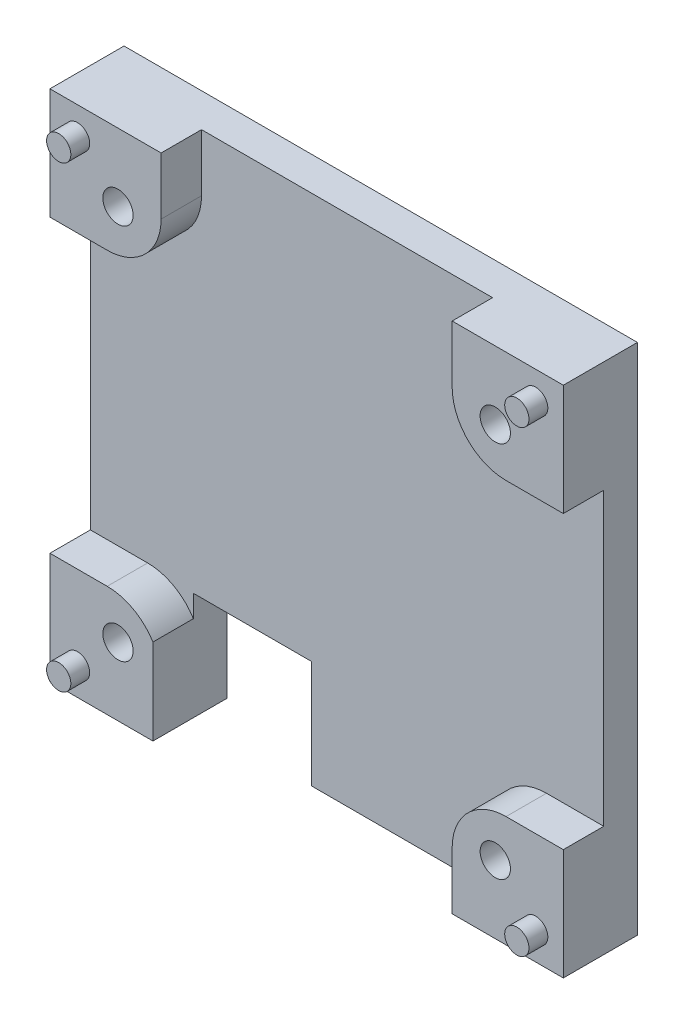
ISO-10303-21;
HEADER;
FILE_DESCRIPTION(('STEP AP214'),'2;1');
FILE_NAME('part.step','',(''),(''),'','','');
FILE_SCHEMA(('AUTOMOTIVE_DESIGN { 1 0 10303 214 1 1 1 1 }'));
ENDSEC;
DATA;
#1=APPLICATION_CONTEXT('core data for automotive mechanical design processes');
#2=APPLICATION_PROTOCOL_DEFINITION('international standard','automotive_design',2000,#1);
#3=PRODUCT_CONTEXT('',#1,'mechanical');
#4=PRODUCT('Part','Part','',(#3));
#5=PRODUCT_RELATED_PRODUCT_CATEGORY('part','',(#4));
#6=PRODUCT_DEFINITION_FORMATION('','',#4);
#7=PRODUCT_DEFINITION_CONTEXT('part definition',#1,'design');
#8=PRODUCT_DEFINITION('design','',#6,#7);
#9=PRODUCT_DEFINITION_SHAPE('','',#8);
#10=(LENGTH_UNIT() NAMED_UNIT(*) SI_UNIT(.MILLI.,.METRE.));
#11=(NAMED_UNIT(*) PLANE_ANGLE_UNIT() SI_UNIT($,.RADIAN.));
#12=(NAMED_UNIT(*) SI_UNIT($,.STERADIAN.) SOLID_ANGLE_UNIT());
#13=UNCERTAINTY_MEASURE_WITH_UNIT(LENGTH_MEASURE(1.E-05),#10,'distance_accuracy_value','');
#14=(GEOMETRIC_REPRESENTATION_CONTEXT(3) GLOBAL_UNCERTAINTY_ASSIGNED_CONTEXT((#13)) GLOBAL_UNIT_ASSIGNED_CONTEXT((#10,
#11,#12)) REPRESENTATION_CONTEXT('',''));
#15=CARTESIAN_POINT('',(0.,0.,0.));
#16=DIRECTION('',(0.,0.,1.));
#17=DIRECTION('',(1.,0.,0.));
#18=AXIS2_PLACEMENT_3D('',#15,#16,#17);
#19=CARTESIAN_POINT('',(-18.5836519970211,-7.48549408860726,-2.5));
#20=DIRECTION('',(0.,-1.,0.));
#21=DIRECTION('',(0.,0.,-1.));
#22=AXIS2_PLACEMENT_3D('',#19,#20,#21);
#23=PLANE('',#22);
#24=DIRECTION('',(0.,0.,-1.));
#25=VECTOR('',#24,1.);
#26=CARTESIAN_POINT('',(-10.9386519970211,-7.48549408860726,7.5));
#27=LINE('',#26,#25);
#28=CARTESIAN_POINT('',(-10.9386519970211,-7.48549408860726,3.));
#29=VERTEX_POINT('',#28);
#30=CARTESIAN_POINT('',(-10.9386519970211,-7.48549408860726,-2.5));
#31=VERTEX_POINT('',#30);
#32=EDGE_CURVE('E214',#29,#31,#27,.T.);
#33=ORIENTED_EDGE('',*,*,#32,.F.);
#34=DIRECTION('',(1.,0.,0.));
#35=VECTOR('',#34,1.);
#36=CARTESIAN_POINT('',(-18.5836519970211,-7.48549408860726,3.));
#37=LINE('',#36,#35);
#38=CARTESIAN_POINT('',(-18.5836519970211,-7.48549408860726,3.));
#39=VERTEX_POINT('',#38);
#40=EDGE_CURVE('E476',#39,#29,#37,.T.);
#41=ORIENTED_EDGE('',*,*,#40,.F.);
#42=DIRECTION('',(0.,0.,1.));
#43=VECTOR('',#42,1.);
#44=CARTESIAN_POINT('',(-18.5836519970211,-7.48549408860726,-2.5));
#45=LINE('',#44,#43);
#46=CARTESIAN_POINT('',(-18.5836519970211,-7.48549408860726,-2.5));
#47=VERTEX_POINT('',#46);
#48=EDGE_CURVE('E248',#47,#39,#45,.T.);
#49=ORIENTED_EDGE('',*,*,#48,.F.);
#50=DIRECTION('',(1.,0.,0.));
#51=VECTOR('',#50,1.);
#52=CARTESIAN_POINT('',(-18.5836519970211,-7.48549408860726,-2.5));
#53=LINE('',#52,#51);
#54=EDGE_CURVE('E231',#47,#31,#53,.T.);
#55=ORIENTED_EDGE('',*,*,#54,.T.);
#56=EDGE_LOOP('',(#33,#41,#49,#55));
#57=FACE_BOUND('',#56,.T.);
#58=ADVANCED_FACE('F43',(#57),#23,.T.);
#59=CARTESIAN_POINT('',(0.,0.,0.));
#60=DIRECTION('',(0.,0.,1.));
#61=DIRECTION('',(1.,0.,0.));
#62=AXIS2_PLACEMENT_3D('',#59,#60,#61);
#63=PLANE('',#62);
#64=DIRECTION('',(0.,1.,0.));
#65=VECTOR('',#64,1.);
#66=CARTESIAN_POINT('',(-2.18865199702105,0.,0.));
#67=LINE('',#66,#65);
#68=CARTESIAN_POINT('',(-2.18865199702105,-7.48549408860726,0.));
#69=VERTEX_POINT('',#68);
#70=CARTESIAN_POINT('',(-2.18865199702105,0.514505911392744,0.));
#71=VERTEX_POINT('',#70);
#72=EDGE_CURVE('E467',#69,#71,#67,.T.);
#73=ORIENTED_EDGE('',*,*,#72,.F.);
#74=DIRECTION('',(1.,0.,0.));
#75=VECTOR('',#74,1.);
#76=CARTESIAN_POINT('',(-18.5836519970211,-7.48549408860726,0.));
#77=LINE('',#76,#75);
#78=CARTESIAN_POINT('',(11.2663480029789,-7.48549408860726,0.));
#79=VERTEX_POINT('',#78);
#80=EDGE_CURVE('E221',#69,#79,#77,.T.);
#81=ORIENTED_EDGE('',*,*,#80,.T.);
#82=DIRECTION('',(0.,-1.,0.));
#83=VECTOR('',#82,1.);
#84=CARTESIAN_POINT('',(11.2663480029789,-7.48549408860726,0.));
#85=LINE('',#84,#83);
#86=CARTESIAN_POINT('',(11.2663480029789,-3.23549408860726,0.));
#87=VERTEX_POINT('',#86);
#88=EDGE_CURVE('E501',#87,#79,#85,.T.);
#89=ORIENTED_EDGE('',*,*,#88,.F.);
#90=CARTESIAN_POINT('',(15.2663480029789,-3.23549408860726,0.));
#91=DIRECTION('',(0.,0.,1.));
#92=DIRECTION('',(1.,0.,0.));
#93=AXIS2_PLACEMENT_3D('',#90,#91,#92);
#94=CIRCLE('',#93,4.);
#95=CARTESIAN_POINT('',(15.2663480029789,0.764505911392739,0.));
#96=VERTEX_POINT('',#95);
#97=EDGE_CURVE('E505',#96,#87,#94,.T.);
#98=ORIENTED_EDGE('',*,*,#97,.F.);
#99=DIRECTION('',(-1.,0.,0.));
#100=VECTOR('',#99,1.);
#101=CARTESIAN_POINT('',(19.516348002979,0.764505911392739,0.));
#102=LINE('',#101,#100);
#103=CARTESIAN_POINT('',(19.5163480029789,0.764505911392738,0.));
#104=VERTEX_POINT('',#103);
#105=EDGE_CURVE('E510',#104,#96,#102,.T.);
#106=ORIENTED_EDGE('',*,*,#105,.F.);
#107=DIRECTION('',(0.,1.,0.));
#108=VECTOR('',#107,1.);
#109=CARTESIAN_POINT('',(19.5163480029789,30.6145059113927,0.));
#110=LINE('',#109,#108);
#111=CARTESIAN_POINT('',(19.5163480029789,22.3645059113927,0.));
#112=VERTEX_POINT('',#111);
#113=EDGE_CURVE('E255',#104,#112,#110,.T.);
#114=ORIENTED_EDGE('',*,*,#113,.T.);
#115=DIRECTION('',(1.,0.,0.));
#116=VECTOR('',#115,1.);
#117=CARTESIAN_POINT('',(19.5163480029789,22.3645059113927,0.));
#118=LINE('',#117,#116);
#119=CARTESIAN_POINT('',(15.2663480029789,22.3645059113927,0.));
#120=VERTEX_POINT('',#119);
#121=EDGE_CURVE('E548',#120,#112,#118,.T.);
#122=ORIENTED_EDGE('',*,*,#121,.F.);
#123=CARTESIAN_POINT('',(15.2663480029789,26.3645059113927,0.));
#124=DIRECTION('',(0.,0.,1.));
#125=DIRECTION('',(-1.,0.,0.));
#126=AXIS2_PLACEMENT_3D('',#123,#124,#125);
#127=CIRCLE('',#126,4.);
#128=CARTESIAN_POINT('',(11.2663480029789,26.3645059113927,0.));
#129=VERTEX_POINT('',#128);
#130=EDGE_CURVE('E302',#129,#120,#127,.T.);
#131=ORIENTED_EDGE('',*,*,#130,.F.);
#132=DIRECTION('',(0.,-1.,0.));
#133=VECTOR('',#132,1.);
#134=CARTESIAN_POINT('',(11.2663480029789,30.6145059113927,0.));
#135=LINE('',#134,#133);
#136=CARTESIAN_POINT('',(11.2663480029789,30.6145059113927,0.));
#137=VERTEX_POINT('',#136);
#138=EDGE_CURVE('E295',#137,#129,#135,.T.);
#139=ORIENTED_EDGE('',*,*,#138,.F.);
#140=DIRECTION('',(-1.,0.,0.));
#141=VECTOR('',#140,1.);
#142=CARTESIAN_POINT('',(-18.5836519970211,30.6145059113927,0.));
#143=LINE('',#142,#141);
#144=CARTESIAN_POINT('',(-10.3336519970211,30.6145059113927,0.));
#145=VERTEX_POINT('',#144);
#146=EDGE_CURVE('E238',#137,#145,#143,.T.);
#147=ORIENTED_EDGE('',*,*,#146,.T.);
#148=DIRECTION('',(0.,1.,0.));
#149=VECTOR('',#148,1.);
#150=CARTESIAN_POINT('',(-10.3336519970211,30.6145059113927,0.));
#151=LINE('',#150,#149);
#152=CARTESIAN_POINT('',(-10.3336519970211,26.3645059113927,0.));
#153=VERTEX_POINT('',#152);
#154=EDGE_CURVE('E312',#153,#145,#151,.T.);
#155=ORIENTED_EDGE('',*,*,#154,.F.);
#156=CARTESIAN_POINT('',(-14.3336519970211,26.3645059113927,0.));
#157=DIRECTION('',(0.,0.,1.));
#158=DIRECTION('',(1.,0.,0.));
#159=AXIS2_PLACEMENT_3D('',#156,#157,#158);
#160=CIRCLE('',#159,4.);
#161=CARTESIAN_POINT('',(-14.3336519970211,22.3645059113927,0.));
#162=VERTEX_POINT('',#161);
#163=EDGE_CURVE('E329',#162,#153,#160,.T.);
#164=ORIENTED_EDGE('',*,*,#163,.F.);
#165=DIRECTION('',(1.,0.,0.));
#166=VECTOR('',#165,1.);
#167=CARTESIAN_POINT('',(-18.5836519970211,22.3645059113927,0.));
#168=LINE('',#167,#166);
#169=CARTESIAN_POINT('',(-18.5836519970211,22.3645059113927,0.));
#170=VERTEX_POINT('',#169);
#171=EDGE_CURVE('E300',#170,#162,#168,.T.);
#172=ORIENTED_EDGE('',*,*,#171,.F.);
#173=DIRECTION('',(0.,-1.,0.));
#174=VECTOR('',#173,1.);
#175=CARTESIAN_POINT('',(-18.5836519970211,30.6145059113927,0.));
#176=LINE('',#175,#174);
#177=CARTESIAN_POINT('',(-18.5836519970211,0.764505911392734,0.));
#178=VERTEX_POINT('',#177);
#179=EDGE_CURVE('E249',#170,#178,#176,.T.);
#180=ORIENTED_EDGE('',*,*,#179,.T.);
#181=DIRECTION('',(-1.,0.,0.));
#182=VECTOR('',#181,1.);
#183=CARTESIAN_POINT('',(-18.5836519970211,0.764505911392735,0.));
#184=LINE('',#183,#182);
#185=CARTESIAN_POINT('',(-14.3336519970211,0.764505911392735,0.));
#186=VERTEX_POINT('',#185);
#187=EDGE_CURVE('E447',#186,#178,#184,.T.);
#188=ORIENTED_EDGE('',*,*,#187,.F.);
#189=CARTESIAN_POINT('',(-14.3336519970211,-3.23549408860727,0.));
#190=DIRECTION('',(0.,0.,1.));
#191=DIRECTION('',(-1.,0.,0.));
#192=AXIS2_PLACEMENT_3D('',#189,#190,#191);
#193=CIRCLE('',#192,4.);
#194=CARTESIAN_POINT('',(-10.9386519970211,-1.12031679107403,0.));
#195=VERTEX_POINT('',#194);
#196=EDGE_CURVE('E66',#195,#186,#193,.T.);
#197=ORIENTED_EDGE('',*,*,#196,.F.);
#198=DIRECTION('',(0.,-1.,0.));
#199=VECTOR('',#198,1.);
#200=CARTESIAN_POINT('',(-10.9386519970211,0.,0.));
#201=LINE('',#200,#199);
#202=CARTESIAN_POINT('',(-10.9386519970211,0.514505911392744,0.));
#203=VERTEX_POINT('',#202);
#204=EDGE_CURVE('E59',#203,#195,#201,.T.);
#205=ORIENTED_EDGE('',*,*,#204,.F.);
#206=DIRECTION('',(-1.,0.,0.));
#207=VECTOR('',#206,1.);
#208=CARTESIAN_POINT('',(0.,0.514505911392744,0.));
#209=LINE('',#208,#207);
#210=EDGE_CURVE('E991',#71,#203,#209,.T.);
#211=ORIENTED_EDGE('',*,*,#210,.F.);
#212=EDGE_LOOP('',(#73,#81,#89,#98,#106,#114,#122,#131,#139,#147,#155,#164,#172,#180,#188,#197,
#205,#211));
#213=FACE_BOUND('',#212,.T.);
#214=ADVANCED_FACE('F394',(#213),#63,.T.);
#215=CARTESIAN_POINT('',(-18.5836519970211,30.6145059113927,-2.5));
#216=DIRECTION('',(-1.,0.,0.));
#217=DIRECTION('',(0.,0.,1.));
#218=AXIS2_PLACEMENT_3D('',#215,#216,#217);
#219=PLANE('',#218);
#220=ORIENTED_EDGE('',*,*,#179,.F.);
#221=DIRECTION('',(0.,0.,-1.));
#222=VECTOR('',#221,1.);
#223=CARTESIAN_POINT('',(-18.5836519970211,22.3645059113927,3.));
#224=LINE('',#223,#222);
#225=CARTESIAN_POINT('',(-18.5836519970211,22.3645059113927,3.));
#226=VERTEX_POINT('',#225);
#227=EDGE_CURVE('E347',#226,#170,#224,.T.);
#228=ORIENTED_EDGE('',*,*,#227,.F.);
#229=DIRECTION('',(0.,-1.,0.));
#230=VECTOR('',#229,1.);
#231=CARTESIAN_POINT('',(-18.5836519970211,30.6145059113927,3.));
#232=LINE('',#231,#230);
#233=CARTESIAN_POINT('',(-18.5836519970211,30.6145059113927,3.));
#234=VERTEX_POINT('',#233);
#235=EDGE_CURVE('E307',#234,#226,#232,.T.);
#236=ORIENTED_EDGE('',*,*,#235,.F.);
#237=DIRECTION('',(0.,0.,1.));
#238=VECTOR('',#237,1.);
#239=CARTESIAN_POINT('',(-18.5836519970211,30.6145059113927,-2.5));
#240=LINE('',#239,#238);
#241=CARTESIAN_POINT('',(-18.5836519970211,30.6145059113927,-2.5));
#242=VERTEX_POINT('',#241);
#243=EDGE_CURVE('E260',#242,#234,#240,.T.);
#244=ORIENTED_EDGE('',*,*,#243,.F.);
#245=DIRECTION('',(0.,-1.,0.));
#246=VECTOR('',#245,1.);
#247=CARTESIAN_POINT('',(-18.5836519970211,30.6145059113927,-2.5));
#248=LINE('',#247,#246);
#249=EDGE_CURVE('E232',#242,#47,#248,.T.);
#250=ORIENTED_EDGE('',*,*,#249,.T.);
#251=ORIENTED_EDGE('',*,*,#48,.T.);
#252=DIRECTION('',(0.,-1.,0.));
#253=VECTOR('',#252,1.);
#254=CARTESIAN_POINT('',(-18.5836519970211,-7.48549408860726,3.));
#255=LINE('',#254,#253);
#256=CARTESIAN_POINT('',(-18.5836519970211,0.764505911392735,3.));
#257=VERTEX_POINT('',#256);
#258=EDGE_CURVE('E457',#257,#39,#255,.T.);
#259=ORIENTED_EDGE('',*,*,#258,.F.);
#260=DIRECTION('',(0.,0.,-1.));
#261=VECTOR('',#260,1.);
#262=CARTESIAN_POINT('',(-18.5836519970211,0.764505911392735,3.));
#263=LINE('',#262,#261);
#264=EDGE_CURVE('E453',#257,#178,#263,.T.);
#265=ORIENTED_EDGE('',*,*,#264,.T.);
#266=EDGE_LOOP('',(#220,#228,#236,#244,#250,#251,#259,#265));
#267=FACE_BOUND('',#266,.T.);
#268=ADVANCED_FACE('F45',(#267),#219,.T.);
#269=CARTESIAN_POINT('',(-18.5836519970211,30.6145059113927,-2.5));
#270=DIRECTION('',(0.,1.,0.));
#271=DIRECTION('',(0.,0.,1.));
#272=AXIS2_PLACEMENT_3D('',#269,#270,#271);
#273=PLANE('',#272);
#274=ORIENTED_EDGE('',*,*,#146,.F.);
#275=DIRECTION('',(0.,0.,-1.));
#276=VECTOR('',#275,1.);
#277=CARTESIAN_POINT('',(11.2663480029789,30.6145059113927,3.));
#278=LINE('',#277,#276);
#279=CARTESIAN_POINT('',(11.2663480029789,30.6145059113927,3.));
#280=VERTEX_POINT('',#279);
#281=EDGE_CURVE('E533',#280,#137,#278,.T.);
#282=ORIENTED_EDGE('',*,*,#281,.F.);
#283=DIRECTION('',(-1.,0.,0.));
#284=VECTOR('',#283,1.);
#285=CARTESIAN_POINT('',(19.5163480029789,30.6145059113927,3.));
#286=LINE('',#285,#284);
#287=CARTESIAN_POINT('',(19.5163480029789,30.6145059113927,3.));
#288=VERTEX_POINT('',#287);
#289=EDGE_CURVE('E562',#288,#280,#286,.T.);
#290=ORIENTED_EDGE('',*,*,#289,.F.);
#291=DIRECTION('',(0.,0.,1.));
#292=VECTOR('',#291,1.);
#293=CARTESIAN_POINT('',(19.5163480029789,30.6145059113927,-2.5));
#294=LINE('',#293,#292);
#295=CARTESIAN_POINT('',(19.5163480029789,30.6145059113927,-2.5));
#296=VERTEX_POINT('',#295);
#297=EDGE_CURVE('E264',#296,#288,#294,.T.);
#298=ORIENTED_EDGE('',*,*,#297,.F.);
#299=DIRECTION('',(-1.,0.,0.));
#300=VECTOR('',#299,1.);
#301=CARTESIAN_POINT('',(-18.5836519970211,30.6145059113927,-2.5));
#302=LINE('',#301,#300);
#303=EDGE_CURVE('E244',#296,#242,#302,.T.);
#304=ORIENTED_EDGE('',*,*,#303,.T.);
#305=ORIENTED_EDGE('',*,*,#243,.T.);
#306=DIRECTION('',(-1.,0.,0.));
#307=VECTOR('',#306,1.);
#308=CARTESIAN_POINT('',(-18.5836519970211,30.6145059113927,3.));
#309=LINE('',#308,#307);
#310=CARTESIAN_POINT('',(-10.3336519970211,30.6145059113927,3.));
#311=VERTEX_POINT('',#310);
#312=EDGE_CURVE('E321',#311,#234,#309,.T.);
#313=ORIENTED_EDGE('',*,*,#312,.F.);
#314=DIRECTION('',(0.,0.,-1.));
#315=VECTOR('',#314,1.);
#316=CARTESIAN_POINT('',(-10.3336519970211,30.6145059113927,3.));
#317=LINE('',#316,#315);
#318=EDGE_CURVE('E325',#311,#145,#317,.T.);
#319=ORIENTED_EDGE('',*,*,#318,.T.);
#320=EDGE_LOOP('',(#274,#282,#290,#298,#304,#305,#313,#319));
#321=FACE_BOUND('',#320,.T.);
#322=ADVANCED_FACE('F411',(#321),#273,.T.);
#323=CARTESIAN_POINT('',(19.5163480029789,30.6145059113927,-2.5));
#324=DIRECTION('',(1.,0.,0.));
#325=DIRECTION('',(0.,0.,-1.));
#326=AXIS2_PLACEMENT_3D('',#323,#324,#325);
#327=PLANE('',#326);
#328=ORIENTED_EDGE('',*,*,#113,.F.);
#329=DIRECTION('',(0.,0.,-1.));
#330=VECTOR('',#329,1.);
#331=CARTESIAN_POINT('',(19.516348002979,0.764505911392739,3.));
#332=LINE('',#331,#330);
#333=CARTESIAN_POINT('',(19.516348002979,0.764505911392739,3.));
#334=VERTEX_POINT('',#333);
#335=EDGE_CURVE('E485',#334,#104,#332,.T.);
#336=ORIENTED_EDGE('',*,*,#335,.F.);
#337=DIRECTION('',(0.,1.,0.));
#338=VECTOR('',#337,1.);
#339=CARTESIAN_POINT('',(19.5163480029789,-7.48549408860726,3.));
#340=LINE('',#339,#338);
#341=CARTESIAN_POINT('',(19.5163480029789,-7.48549408860726,3.));
#342=VERTEX_POINT('',#341);
#343=EDGE_CURVE('E506',#342,#334,#340,.T.);
#344=ORIENTED_EDGE('',*,*,#343,.F.);
#345=DIRECTION('',(0.,0.,1.));
#346=VECTOR('',#345,1.);
#347=CARTESIAN_POINT('',(19.5163480029789,-7.48549408860726,-2.5));
#348=LINE('',#347,#346);
#349=CARTESIAN_POINT('',(19.5163480029789,-7.48549408860726,-2.5));
#350=VERTEX_POINT('',#349);
#351=EDGE_CURVE('E267',#350,#342,#348,.T.);
#352=ORIENTED_EDGE('',*,*,#351,.F.);
#353=DIRECTION('',(0.,1.,0.));
#354=VECTOR('',#353,1.);
#355=CARTESIAN_POINT('',(19.5163480029789,30.6145059113927,-2.5));
#356=LINE('',#355,#354);
#357=EDGE_CURVE('E229',#350,#296,#356,.T.);
#358=ORIENTED_EDGE('',*,*,#357,.T.);
#359=ORIENTED_EDGE('',*,*,#297,.T.);
#360=DIRECTION('',(0.,1.,0.));
#361=VECTOR('',#360,1.);
#362=CARTESIAN_POINT('',(19.5163480029789,30.6145059113927,3.));
#363=LINE('',#362,#361);
#364=CARTESIAN_POINT('',(19.5163480029789,22.3645059113927,3.));
#365=VERTEX_POINT('',#364);
#366=EDGE_CURVE('E288',#365,#288,#363,.T.);
#367=ORIENTED_EDGE('',*,*,#366,.F.);
#368=DIRECTION('',(0.,0.,-1.));
#369=VECTOR('',#368,1.);
#370=CARTESIAN_POINT('',(19.5163480029789,22.3645059113927,3.));
#371=LINE('',#370,#369);
#372=EDGE_CURVE('E543',#365,#112,#371,.T.);
#373=ORIENTED_EDGE('',*,*,#372,.T.);
#374=EDGE_LOOP('',(#328,#336,#344,#352,#358,#359,#367,#373));
#375=FACE_BOUND('',#374,.T.);
#376=ADVANCED_FACE('F404',(#375),#327,.T.);
#377=DIRECTION('',(0.,0.,-1.));
#378=VECTOR('',#377,1.);
#379=CARTESIAN_POINT('',(-2.18865199702105,-7.48549408860726,7.5));
#380=LINE('',#379,#378);
#381=CARTESIAN_POINT('',(-2.18865199702105,-7.48549408860726,-2.5));
#382=VERTEX_POINT('',#381);
#383=EDGE_CURVE('E204',#69,#382,#380,.T.);
#384=ORIENTED_EDGE('',*,*,#383,.T.);
#385=EDGE_CURVE('E218',#382,#350,#53,.T.);
#386=ORIENTED_EDGE('',*,*,#385,.T.);
#387=ORIENTED_EDGE('',*,*,#351,.T.);
#388=DIRECTION('',(1.,0.,0.));
#389=VECTOR('',#388,1.);
#390=CARTESIAN_POINT('',(19.5163480029789,-7.48549408860726,3.));
#391=LINE('',#390,#389);
#392=CARTESIAN_POINT('',(11.2663480029789,-7.48549408860726,3.));
#393=VERTEX_POINT('',#392);
#394=EDGE_CURVE('E500',#393,#342,#391,.T.);
#395=ORIENTED_EDGE('',*,*,#394,.F.);
#396=DIRECTION('',(0.,0.,-1.));
#397=VECTOR('',#396,1.);
#398=CARTESIAN_POINT('',(11.2663480029789,-7.48549408860726,3.));
#399=LINE('',#398,#397);
#400=EDGE_CURVE('E497',#393,#79,#399,.T.);
#401=ORIENTED_EDGE('',*,*,#400,.T.);
#402=ORIENTED_EDGE('',*,*,#80,.F.);
#403=EDGE_LOOP('',(#384,#386,#387,#395,#401,#402));
#404=FACE_BOUND('',#403,.T.);
#405=ADVANCED_FACE('F217',(#404),#23,.T.);
#406=CARTESIAN_POINT('',(0.,0.,-2.5));
#407=DIRECTION('',(0.,0.,1.));
#408=DIRECTION('',(1.,0.,0.));
#409=AXIS2_PLACEMENT_3D('',#406,#407,#408);
#410=PLANE('',#409);
#411=CARTESIAN_POINT('',(-13.5336519970211,-2.43549408860726,-2.5));
#412=DIRECTION('',(0.,0.,1.));
#413=DIRECTION('',(1.,0.,0.));
#414=AXIS2_PLACEMENT_3D('',#411,#412,#413);
#415=CIRCLE('',#414,1.125);
#416=CARTESIAN_POINT('',(-12.4086519970211,-2.43549408860726,-2.5));
#417=VERTEX_POINT('',#416);
#418=EDGE_CURVE('E351',#417,#417,#415,.T.);
#419=ORIENTED_EDGE('',*,*,#418,.T.);
#420=EDGE_LOOP('',(#419));
#421=FACE_BOUND('',#420,.T.);
#422=CARTESIAN_POINT('',(14.4663480029789,-2.43549408860726,-2.5));
#423=DIRECTION('',(0.,0.,1.));
#424=DIRECTION('',(1.,0.,0.));
#425=AXIS2_PLACEMENT_3D('',#422,#423,#424);
#426=CIRCLE('',#425,1.125);
#427=CARTESIAN_POINT('',(15.5913480029789,-2.43549408860726,-2.5));
#428=VERTEX_POINT('',#427);
#429=EDGE_CURVE('E355',#428,#428,#426,.T.);
#430=ORIENTED_EDGE('',*,*,#429,.T.);
#431=EDGE_LOOP('',(#430));
#432=FACE_BOUND('',#431,.T.);
#433=CARTESIAN_POINT('',(14.4663480029789,25.5645059113927,-2.5));
#434=DIRECTION('',(0.,0.,1.));
#435=DIRECTION('',(1.,0.,0.));
#436=AXIS2_PLACEMENT_3D('',#433,#434,#435);
#437=CIRCLE('',#436,1.125);
#438=CARTESIAN_POINT('',(15.5913480029789,25.5645059113927,-2.5));
#439=VERTEX_POINT('',#438);
#440=EDGE_CURVE('E359',#439,#439,#437,.T.);
#441=ORIENTED_EDGE('',*,*,#440,.T.);
#442=EDGE_LOOP('',(#441));
#443=FACE_BOUND('',#442,.T.);
#444=CARTESIAN_POINT('',(-13.5336519970211,25.5645059113927,-2.5));
#445=DIRECTION('',(0.,0.,1.));
#446=DIRECTION('',(1.,0.,0.));
#447=AXIS2_PLACEMENT_3D('',#444,#445,#446);
#448=CIRCLE('',#447,1.125);
#449=CARTESIAN_POINT('',(-12.4086519970211,25.5645059113927,-2.5));
#450=VERTEX_POINT('',#449);
#451=EDGE_CURVE('E252',#450,#450,#448,.T.);
#452=ORIENTED_EDGE('',*,*,#451,.T.);
#453=EDGE_LOOP('',(#452));
#454=FACE_BOUND('',#453,.T.);
#455=DIRECTION('',(0.,1.,0.));
#456=VECTOR('',#455,1.);
#457=CARTESIAN_POINT('',(-10.9386519970211,0.514505911392744,-2.5));
#458=LINE('',#457,#456);
#459=CARTESIAN_POINT('',(-10.9386519970211,0.514505911392744,-2.5));
#460=VERTEX_POINT('',#459);
#461=EDGE_CURVE('E213',#31,#460,#458,.T.);
#462=ORIENTED_EDGE('',*,*,#461,.F.);
#463=ORIENTED_EDGE('',*,*,#54,.F.);
#464=ORIENTED_EDGE('',*,*,#249,.F.);
#465=ORIENTED_EDGE('',*,*,#303,.F.);
#466=ORIENTED_EDGE('',*,*,#357,.F.);
#467=ORIENTED_EDGE('',*,*,#385,.F.);
#468=DIRECTION('',(0.,-1.,0.));
#469=VECTOR('',#468,1.);
#470=CARTESIAN_POINT('',(-2.18865199702105,0.514505911392744,-2.5));
#471=LINE('',#470,#469);
#472=CARTESIAN_POINT('',(-2.18865199702105,0.514505911392744,-2.5));
#473=VERTEX_POINT('',#472);
#474=EDGE_CURVE('E201',#473,#382,#471,.T.);
#475=ORIENTED_EDGE('',*,*,#474,.F.);
#476=DIRECTION('',(1.,0.,0.));
#477=VECTOR('',#476,1.);
#478=CARTESIAN_POINT('',(-2.18865199702105,0.514505911392744,-2.5));
#479=LINE('',#478,#477);
#480=EDGE_CURVE('E997',#460,#473,#479,.T.);
#481=ORIENTED_EDGE('',*,*,#480,.F.);
#482=EDGE_LOOP('',(#462,#463,#464,#465,#466,#467,#475,#481));
#483=FACE_BOUND('',#482,.T.);
#484=ADVANCED_FACE('F226',(#421,#432,#443,#454,#483),#410,.F.);
#485=CARTESIAN_POINT('',(-13.5336519970211,25.5645059113927,-2.5));
#486=DIRECTION('',(0.,0.,1.));
#487=DIRECTION('',(1.,0.,0.));
#488=AXIS2_PLACEMENT_3D('',#485,#486,#487);
#489=CYLINDRICAL_SURFACE('',#488,1.125);
#490=ORIENTED_EDGE('',*,*,#451,.F.);
#491=EDGE_LOOP('',(#490));
#492=FACE_BOUND('',#491,.T.);
#493=CARTESIAN_POINT('',(-13.5336519970211,25.5645059113927,3.));
#494=DIRECTION('',(0.,0.,1.));
#495=DIRECTION('',(1.,0.,0.));
#496=AXIS2_PLACEMENT_3D('',#493,#494,#495);
#497=CIRCLE('',#496,1.125);
#498=CARTESIAN_POINT('',(-12.4086519970211,25.5645059113927,3.));
#499=VERTEX_POINT('',#498);
#500=EDGE_CURVE('E294',#499,#499,#497,.T.);
#501=ORIENTED_EDGE('',*,*,#500,.T.);
#502=EDGE_LOOP('',(#501));
#503=FACE_BOUND('',#502,.T.);
#504=ADVANCED_FACE('F367',(#492,#503),#489,.F.);
#505=CARTESIAN_POINT('',(14.4663480029789,25.5645059113927,-2.5));
#506=DIRECTION('',(0.,0.,1.));
#507=DIRECTION('',(1.,0.,0.));
#508=AXIS2_PLACEMENT_3D('',#505,#506,#507);
#509=CYLINDRICAL_SURFACE('',#508,1.125);
#510=ORIENTED_EDGE('',*,*,#440,.F.);
#511=EDGE_LOOP('',(#510));
#512=FACE_BOUND('',#511,.T.);
#513=CARTESIAN_POINT('',(14.4663480029789,25.5645059113927,3.));
#514=DIRECTION('',(0.,0.,1.));
#515=DIRECTION('',(1.,0.,0.));
#516=AXIS2_PLACEMENT_3D('',#513,#514,#515);
#517=CIRCLE('',#516,1.125);
#518=CARTESIAN_POINT('',(15.5913480029789,25.5645059113927,3.));
#519=VERTEX_POINT('',#518);
#520=EDGE_CURVE('E291',#519,#519,#517,.T.);
#521=ORIENTED_EDGE('',*,*,#520,.T.);
#522=EDGE_LOOP('',(#521));
#523=FACE_BOUND('',#522,.T.);
#524=ADVANCED_FACE('F370',(#512,#523),#509,.F.);
#525=CARTESIAN_POINT('',(14.4663480029789,-2.43549408860726,-2.5));
#526=DIRECTION('',(0.,0.,1.));
#527=DIRECTION('',(1.,0.,0.));
#528=AXIS2_PLACEMENT_3D('',#525,#526,#527);
#529=CYLINDRICAL_SURFACE('',#528,1.125);
#530=ORIENTED_EDGE('',*,*,#429,.F.);
#531=EDGE_LOOP('',(#530));
#532=FACE_BOUND('',#531,.T.);
#533=CARTESIAN_POINT('',(14.4663480029789,-2.43549408860726,3.));
#534=DIRECTION('',(0.,0.,1.));
#535=DIRECTION('',(1.,0.,0.));
#536=AXIS2_PLACEMENT_3D('',#533,#534,#535);
#537=CIRCLE('',#536,1.125);
#538=CARTESIAN_POINT('',(15.5913480029789,-2.43549408860726,3.));
#539=VERTEX_POINT('',#538);
#540=EDGE_CURVE('E514',#539,#539,#537,.T.);
#541=ORIENTED_EDGE('',*,*,#540,.T.);
#542=EDGE_LOOP('',(#541));
#543=FACE_BOUND('',#542,.T.);
#544=ADVANCED_FACE('F387',(#532,#543),#529,.F.);
#545=CARTESIAN_POINT('',(-13.5336519970211,-2.43549408860726,-2.5));
#546=DIRECTION('',(0.,0.,1.));
#547=DIRECTION('',(1.,0.,0.));
#548=AXIS2_PLACEMENT_3D('',#545,#546,#547);
#549=CYLINDRICAL_SURFACE('',#548,1.125);
#550=ORIENTED_EDGE('',*,*,#418,.F.);
#551=EDGE_LOOP('',(#550));
#552=FACE_BOUND('',#551,.T.);
#553=CARTESIAN_POINT('',(-13.5336519970211,-2.43549408860726,3.));
#554=DIRECTION('',(0.,0.,1.));
#555=DIRECTION('',(1.,0.,0.));
#556=AXIS2_PLACEMENT_3D('',#553,#554,#555);
#557=CIRCLE('',#556,1.125);
#558=CARTESIAN_POINT('',(-12.4086519970211,-2.43549408860726,3.));
#559=VERTEX_POINT('',#558);
#560=EDGE_CURVE('E472',#559,#559,#557,.T.);
#561=ORIENTED_EDGE('',*,*,#560,.T.);
#562=EDGE_LOOP('',(#561));
#563=FACE_BOUND('',#562,.T.);
#564=ADVANCED_FACE('F377',(#552,#563),#549,.F.);
#565=CARTESIAN_POINT('',(-14.3336519970211,26.3645059113927,3.));
#566=DIRECTION('',(0.,0.,1.));
#567=DIRECTION('',(1.,0.,0.));
#568=AXIS2_PLACEMENT_3D('',#565,#566,#567);
#569=PLANE('',#568);
#570=CARTESIAN_POINT('',(-16.5336519970211,28.5645059113927,3.));
#571=DIRECTION('',(0.,0.,1.));
#572=DIRECTION('',(1.,0.,0.));
#573=AXIS2_PLACEMENT_3D('',#570,#571,#572);
#574=CIRCLE('',#573,0.900000000000001);
#575=CARTESIAN_POINT('',(-15.6336519970211,28.5645059113927,3.));
#576=VERTEX_POINT('',#575);
#577=EDGE_CURVE('E1025',#576,#576,#574,.T.);
#578=ORIENTED_EDGE('',*,*,#577,.F.);
#579=EDGE_LOOP('',(#578));
#580=FACE_BOUND('',#579,.T.);
#581=ORIENTED_EDGE('',*,*,#235,.T.);
#582=DIRECTION('',(1.,0.,0.));
#583=VECTOR('',#582,1.);
#584=CARTESIAN_POINT('',(-18.5836519970211,22.3645059113927,3.));
#585=LINE('',#584,#583);
#586=CARTESIAN_POINT('',(-14.3336519970211,22.3645059113927,3.));
#587=VERTEX_POINT('',#586);
#588=EDGE_CURVE('E311',#226,#587,#585,.T.);
#589=ORIENTED_EDGE('',*,*,#588,.T.);
#590=CARTESIAN_POINT('',(-14.3336519970211,26.3645059113927,3.));
#591=DIRECTION('',(0.,0.,1.));
#592=DIRECTION('',(1.,0.,0.));
#593=AXIS2_PLACEMENT_3D('',#590,#591,#592);
#594=CIRCLE('',#593,4.);
#595=CARTESIAN_POINT('',(-10.3336519970211,26.3645059113927,3.));
#596=VERTEX_POINT('',#595);
#597=EDGE_CURVE('E315',#587,#596,#594,.T.);
#598=ORIENTED_EDGE('',*,*,#597,.T.);
#599=DIRECTION('',(0.,1.,0.));
#600=VECTOR('',#599,1.);
#601=CARTESIAN_POINT('',(-10.3336519970211,30.6145059113927,3.));
#602=LINE('',#601,#600);
#603=EDGE_CURVE('E318',#596,#311,#602,.T.);
#604=ORIENTED_EDGE('',*,*,#603,.T.);
#605=ORIENTED_EDGE('',*,*,#312,.T.);
#606=EDGE_LOOP('',(#581,#589,#598,#604,#605));
#607=FACE_BOUND('',#606,.T.);
#608=ORIENTED_EDGE('',*,*,#500,.F.);
#609=EDGE_LOOP('',(#608));
#610=FACE_BOUND('',#609,.T.);
#611=ADVANCED_FACE('F374',(#580,#607,#610),#569,.T.);
#612=CARTESIAN_POINT('',(-18.5836519970211,22.3645059113927,3.));
#613=DIRECTION('',(0.,1.,0.));
#614=DIRECTION('',(-1.,0.,0.));
#615=AXIS2_PLACEMENT_3D('',#612,#613,#614);
#616=PLANE('',#615);
#617=ORIENTED_EDGE('',*,*,#171,.T.);
#618=DIRECTION('',(0.,0.,-1.));
#619=VECTOR('',#618,1.);
#620=CARTESIAN_POINT('',(-14.3336519970211,22.3645059113927,3.));
#621=LINE('',#620,#619);
#622=EDGE_CURVE('E343',#587,#162,#621,.T.);
#623=ORIENTED_EDGE('',*,*,#622,.F.);
#624=ORIENTED_EDGE('',*,*,#588,.F.);
#625=ORIENTED_EDGE('',*,*,#227,.T.);
#626=EDGE_LOOP('',(#617,#623,#624,#625));
#627=FACE_BOUND('',#626,.T.);
#628=ADVANCED_FACE('F376',(#627),#616,.F.);
#629=CARTESIAN_POINT('',(-14.3336519970211,26.3645059113927,3.));
#630=DIRECTION('',(0.,0.,-1.));
#631=DIRECTION('',(-1.,0.,0.));
#632=AXIS2_PLACEMENT_3D('',#629,#630,#631);
#633=CYLINDRICAL_SURFACE('',#632,4.);
#634=ORIENTED_EDGE('',*,*,#163,.T.);
#635=DIRECTION('',(0.,0.,-1.));
#636=VECTOR('',#635,1.);
#637=CARTESIAN_POINT('',(-10.3336519970211,26.3645059113927,3.));
#638=LINE('',#637,#636);
#639=EDGE_CURVE('E339',#596,#153,#638,.T.);
#640=ORIENTED_EDGE('',*,*,#639,.F.);
#641=ORIENTED_EDGE('',*,*,#597,.F.);
#642=ORIENTED_EDGE('',*,*,#622,.T.);
#643=EDGE_LOOP('',(#634,#640,#641,#642));
#644=FACE_BOUND('',#643,.T.);
#645=ADVANCED_FACE('F384',(#644),#633,.T.);
#646=CARTESIAN_POINT('',(-10.3336519970211,30.6145059113927,3.));
#647=DIRECTION('',(-1.,0.,0.));
#648=DIRECTION('',(0.,0.,1.));
#649=AXIS2_PLACEMENT_3D('',#646,#647,#648);
#650=PLANE('',#649);
#651=ORIENTED_EDGE('',*,*,#154,.T.);
#652=ORIENTED_EDGE('',*,*,#318,.F.);
#653=ORIENTED_EDGE('',*,*,#603,.F.);
#654=ORIENTED_EDGE('',*,*,#639,.T.);
#655=EDGE_LOOP('',(#651,#652,#653,#654));
#656=FACE_BOUND('',#655,.T.);
#657=ADVANCED_FACE('F283',(#656),#650,.F.);
#658=CARTESIAN_POINT('',(15.2663480029789,26.3645059113927,3.));
#659=DIRECTION('',(0.,0.,-1.));
#660=DIRECTION('',(-1.,0.,0.));
#661=AXIS2_PLACEMENT_3D('',#658,#659,#660);
#662=PLANE('',#661);
#663=CARTESIAN_POINT('',(17.466348002979,28.5645059113927,3.));
#664=DIRECTION('',(0.,0.,-1.));
#665=DIRECTION('',(-1.,0.,0.));
#666=AXIS2_PLACEMENT_3D('',#663,#664,#665);
#667=CIRCLE('',#666,0.900000000000001);
#668=CARTESIAN_POINT('',(16.5663480029789,28.5645059113927,3.));
#669=VERTEX_POINT('',#668);
#670=EDGE_CURVE('E52',#669,#669,#667,.F.);
#671=ORIENTED_EDGE('',*,*,#670,.F.);
#672=EDGE_LOOP('',(#671));
#673=FACE_BOUND('',#672,.T.);
#674=ORIENTED_EDGE('',*,*,#366,.T.);
#675=ORIENTED_EDGE('',*,*,#289,.T.);
#676=DIRECTION('',(0.,-1.,0.));
#677=VECTOR('',#676,1.);
#678=CARTESIAN_POINT('',(11.2663480029789,30.6145059113927,3.));
#679=LINE('',#678,#677);
#680=CARTESIAN_POINT('',(11.2663480029789,26.3645059113927,3.));
#681=VERTEX_POINT('',#680);
#682=EDGE_CURVE('E560',#280,#681,#679,.T.);
#683=ORIENTED_EDGE('',*,*,#682,.T.);
#684=CARTESIAN_POINT('',(15.2663480029789,26.3645059113927,3.));
#685=DIRECTION('',(0.,0.,1.));
#686=DIRECTION('',(-1.,0.,0.));
#687=AXIS2_PLACEMENT_3D('',#684,#685,#686);
#688=CIRCLE('',#687,4.);
#689=CARTESIAN_POINT('',(15.2663480029789,22.3645059113927,3.));
#690=VERTEX_POINT('',#689);
#691=EDGE_CURVE('E557',#681,#690,#688,.T.);
#692=ORIENTED_EDGE('',*,*,#691,.T.);
#693=DIRECTION('',(1.,0.,0.));
#694=VECTOR('',#693,1.);
#695=CARTESIAN_POINT('',(19.5163480029789,22.3645059113927,3.));
#696=LINE('',#695,#694);
#697=EDGE_CURVE('E547',#690,#365,#696,.T.);
#698=ORIENTED_EDGE('',*,*,#697,.T.);
#699=EDGE_LOOP('',(#674,#675,#683,#692,#698));
#700=FACE_BOUND('',#699,.T.);
#701=ORIENTED_EDGE('',*,*,#520,.F.);
#702=EDGE_LOOP('',(#701));
#703=FACE_BOUND('',#702,.T.);
#704=ADVANCED_FACE('F279',(#673,#700,#703),#662,.F.);
#705=CARTESIAN_POINT('',(11.2663480029789,30.6145059113927,3.));
#706=DIRECTION('',(1.,0.,0.));
#707=DIRECTION('',(0.,0.,-1.));
#708=AXIS2_PLACEMENT_3D('',#705,#706,#707);
#709=PLANE('',#708);
#710=ORIENTED_EDGE('',*,*,#138,.T.);
#711=DIRECTION('',(0.,0.,-1.));
#712=VECTOR('',#711,1.);
#713=CARTESIAN_POINT('',(11.2663480029789,26.3645059113927,3.));
#714=LINE('',#713,#712);
#715=EDGE_CURVE('E536',#681,#129,#714,.T.);
#716=ORIENTED_EDGE('',*,*,#715,.F.);
#717=ORIENTED_EDGE('',*,*,#682,.F.);
#718=ORIENTED_EDGE('',*,*,#281,.T.);
#719=EDGE_LOOP('',(#710,#716,#717,#718));
#720=FACE_BOUND('',#719,.T.);
#721=ADVANCED_FACE('F282',(#720),#709,.F.);
#722=CARTESIAN_POINT('',(15.2663480029789,26.3645059113927,3.));
#723=DIRECTION('',(0.,0.,-1.));
#724=DIRECTION('',(-1.,0.,0.));
#725=AXIS2_PLACEMENT_3D('',#722,#723,#724);
#726=CYLINDRICAL_SURFACE('',#725,4.);
#727=ORIENTED_EDGE('',*,*,#130,.T.);
#728=DIRECTION('',(0.,0.,-1.));
#729=VECTOR('',#728,1.);
#730=CARTESIAN_POINT('',(15.2663480029789,22.3645059113927,3.));
#731=LINE('',#730,#729);
#732=EDGE_CURVE('E540',#690,#120,#731,.T.);
#733=ORIENTED_EDGE('',*,*,#732,.F.);
#734=ORIENTED_EDGE('',*,*,#691,.F.);
#735=ORIENTED_EDGE('',*,*,#715,.T.);
#736=EDGE_LOOP('',(#727,#733,#734,#735));
#737=FACE_BOUND('',#736,.T.);
#738=ADVANCED_FACE('F574',(#737),#726,.T.);
#739=CARTESIAN_POINT('',(19.5163480029789,22.3645059113927,3.));
#740=DIRECTION('',(0.,1.,0.));
#741=DIRECTION('',(0.,0.,1.));
#742=AXIS2_PLACEMENT_3D('',#739,#740,#741);
#743=PLANE('',#742);
#744=ORIENTED_EDGE('',*,*,#121,.T.);
#745=ORIENTED_EDGE('',*,*,#372,.F.);
#746=ORIENTED_EDGE('',*,*,#697,.F.);
#747=ORIENTED_EDGE('',*,*,#732,.T.);
#748=EDGE_LOOP('',(#744,#745,#746,#747));
#749=FACE_BOUND('',#748,.T.);
#750=ADVANCED_FACE('F578',(#749),#743,.F.);
#751=CARTESIAN_POINT('',(15.2663480029789,-3.23549408860726,3.));
#752=DIRECTION('',(0.,0.,1.));
#753=DIRECTION('',(1.,0.,0.));
#754=AXIS2_PLACEMENT_3D('',#751,#752,#753);
#755=PLANE('',#754);
#756=CARTESIAN_POINT('',(17.466348002979,-5.43549408860726,3.));
#757=DIRECTION('',(0.,0.,1.));
#758=DIRECTION('',(1.,0.,0.));
#759=AXIS2_PLACEMENT_3D('',#756,#757,#758);
#760=CIRCLE('',#759,0.9);
#761=CARTESIAN_POINT('',(18.366348002979,-5.43549408860726,3.));
#762=VERTEX_POINT('',#761);
#763=EDGE_CURVE('E1036',#762,#762,#760,.T.);
#764=ORIENTED_EDGE('',*,*,#763,.F.);
#765=EDGE_LOOP('',(#764));
#766=FACE_BOUND('',#765,.T.);
#767=ORIENTED_EDGE('',*,*,#343,.T.);
#768=DIRECTION('',(-1.,0.,0.));
#769=VECTOR('',#768,1.);
#770=CARTESIAN_POINT('',(19.516348002979,0.764505911392739,3.));
#771=LINE('',#770,#769);
#772=CARTESIAN_POINT('',(15.2663480029789,0.764505911392739,3.));
#773=VERTEX_POINT('',#772);
#774=EDGE_CURVE('E524',#334,#773,#771,.T.);
#775=ORIENTED_EDGE('',*,*,#774,.T.);
#776=CARTESIAN_POINT('',(15.2663480029789,-3.23549408860726,3.));
#777=DIRECTION('',(0.,0.,1.));
#778=DIRECTION('',(1.,0.,0.));
#779=AXIS2_PLACEMENT_3D('',#776,#777,#778);
#780=CIRCLE('',#779,4.);
#781=CARTESIAN_POINT('',(11.2663480029789,-3.23549408860726,3.));
#782=VERTEX_POINT('',#781);
#783=EDGE_CURVE('E521',#773,#782,#780,.T.);
#784=ORIENTED_EDGE('',*,*,#783,.T.);
#785=DIRECTION('',(0.,-1.,0.));
#786=VECTOR('',#785,1.);
#787=CARTESIAN_POINT('',(11.2663480029789,-7.48549408860726,3.));
#788=LINE('',#787,#786);
#789=EDGE_CURVE('E518',#782,#393,#788,.T.);
#790=ORIENTED_EDGE('',*,*,#789,.T.);
#791=ORIENTED_EDGE('',*,*,#394,.T.);
#792=EDGE_LOOP('',(#767,#775,#784,#790,#791));
#793=FACE_BOUND('',#792,.T.);
#794=ORIENTED_EDGE('',*,*,#540,.F.);
#795=EDGE_LOOP('',(#794));
#796=FACE_BOUND('',#795,.T.);
#797=ADVANCED_FACE('F607',(#766,#793,#796),#755,.T.);
#798=CARTESIAN_POINT('',(19.516348002979,0.764505911392739,3.));
#799=DIRECTION('',(0.,-1.,0.));
#800=DIRECTION('',(1.,0.,0.));
#801=AXIS2_PLACEMENT_3D('',#798,#799,#800);
#802=PLANE('',#801);
#803=ORIENTED_EDGE('',*,*,#105,.T.);
#804=DIRECTION('',(0.,0.,-1.));
#805=VECTOR('',#804,1.);
#806=CARTESIAN_POINT('',(15.2663480029789,0.764505911392739,3.));
#807=LINE('',#806,#805);
#808=EDGE_CURVE('E489',#773,#96,#807,.T.);
#809=ORIENTED_EDGE('',*,*,#808,.F.);
#810=ORIENTED_EDGE('',*,*,#774,.F.);
#811=ORIENTED_EDGE('',*,*,#335,.T.);
#812=EDGE_LOOP('',(#803,#809,#810,#811));
#813=FACE_BOUND('',#812,.T.);
#814=ADVANCED_FACE('F603',(#813),#802,.F.);
#815=CARTESIAN_POINT('',(15.2663480029789,-3.23549408860726,3.));
#816=DIRECTION('',(0.,0.,-1.));
#817=DIRECTION('',(-1.,0.,0.));
#818=AXIS2_PLACEMENT_3D('',#815,#816,#817);
#819=CYLINDRICAL_SURFACE('',#818,4.);
#820=ORIENTED_EDGE('',*,*,#97,.T.);
#821=DIRECTION('',(0.,0.,-1.));
#822=VECTOR('',#821,1.);
#823=CARTESIAN_POINT('',(11.2663480029789,-3.23549408860726,3.));
#824=LINE('',#823,#822);
#825=EDGE_CURVE('E493',#782,#87,#824,.T.);
#826=ORIENTED_EDGE('',*,*,#825,.F.);
#827=ORIENTED_EDGE('',*,*,#783,.F.);
#828=ORIENTED_EDGE('',*,*,#808,.T.);
#829=EDGE_LOOP('',(#820,#826,#827,#828));
#830=FACE_BOUND('',#829,.T.);
#831=ADVANCED_FACE('F606',(#830),#819,.T.);
#832=CARTESIAN_POINT('',(11.2663480029789,-7.48549408860726,3.));
#833=DIRECTION('',(1.,0.,0.));
#834=DIRECTION('',(0.,0.,-1.));
#835=AXIS2_PLACEMENT_3D('',#832,#833,#834);
#836=PLANE('',#835);
#837=ORIENTED_EDGE('',*,*,#88,.T.);
#838=ORIENTED_EDGE('',*,*,#400,.F.);
#839=ORIENTED_EDGE('',*,*,#789,.F.);
#840=ORIENTED_EDGE('',*,*,#825,.T.);
#841=EDGE_LOOP('',(#837,#838,#839,#840));
#842=FACE_BOUND('',#841,.T.);
#843=ADVANCED_FACE('F597',(#842),#836,.F.);
#844=CARTESIAN_POINT('',(-14.3336519970211,-3.23549408860727,3.));
#845=DIRECTION('',(0.,0.,-1.));
#846=DIRECTION('',(-1.,0.,0.));
#847=AXIS2_PLACEMENT_3D('',#844,#845,#846);
#848=PLANE('',#847);
#849=CARTESIAN_POINT('',(-16.5336519970211,-5.43549408860726,3.));
#850=DIRECTION('',(0.,0.,-1.));
#851=DIRECTION('',(-1.,0.,0.));
#852=AXIS2_PLACEMENT_3D('',#849,#850,#851);
#853=CIRCLE('',#852,0.9);
#854=CARTESIAN_POINT('',(-17.4336519970211,-5.43549408860726,3.));
#855=VERTEX_POINT('',#854);
#856=EDGE_CURVE('E11',#855,#855,#853,.F.);
#857=ORIENTED_EDGE('',*,*,#856,.F.);
#858=EDGE_LOOP('',(#857));
#859=FACE_BOUND('',#858,.T.);
#860=ORIENTED_EDGE('',*,*,#40,.T.);
#861=DIRECTION('',(0.,1.,0.));
#862=VECTOR('',#861,1.);
#863=CARTESIAN_POINT('',(-10.9386519970211,-3.23549408860727,3.));
#864=LINE('',#863,#862);
#865=CARTESIAN_POINT('',(-10.9386519970211,-1.12031679107403,3.));
#866=VERTEX_POINT('',#865);
#867=EDGE_CURVE('E588',#29,#866,#864,.T.);
#868=ORIENTED_EDGE('',*,*,#867,.T.);
#869=CARTESIAN_POINT('',(-14.3336519970211,-3.23549408860727,3.));
#870=DIRECTION('',(0.,0.,1.));
#871=DIRECTION('',(-1.,0.,0.));
#872=AXIS2_PLACEMENT_3D('',#869,#870,#871);
#873=CIRCLE('',#872,4.);
#874=CARTESIAN_POINT('',(-14.3336519970211,0.764505911392735,3.));
#875=VERTEX_POINT('',#874);
#876=EDGE_CURVE('E465',#866,#875,#873,.T.);
#877=ORIENTED_EDGE('',*,*,#876,.T.);
#878=DIRECTION('',(-1.,0.,0.));
#879=VECTOR('',#878,1.);
#880=CARTESIAN_POINT('',(-18.5836519970211,0.764505911392735,3.));
#881=LINE('',#880,#879);
#882=EDGE_CURVE('E461',#875,#257,#881,.T.);
#883=ORIENTED_EDGE('',*,*,#882,.T.);
#884=ORIENTED_EDGE('',*,*,#258,.T.);
#885=EDGE_LOOP('',(#860,#868,#877,#883,#884));
#886=FACE_BOUND('',#885,.T.);
#887=ORIENTED_EDGE('',*,*,#560,.F.);
#888=EDGE_LOOP('',(#887));
#889=FACE_BOUND('',#888,.T.);
#890=ADVANCED_FACE('F585',(#859,#886,#889),#848,.F.);
#891=CARTESIAN_POINT('',(-14.3336519970211,-3.23549408860727,3.));
#892=DIRECTION('',(0.,0.,-1.));
#893=DIRECTION('',(-1.,0.,0.));
#894=AXIS2_PLACEMENT_3D('',#891,#892,#893);
#895=CYLINDRICAL_SURFACE('',#894,4.);
#896=ORIENTED_EDGE('',*,*,#876,.F.);
#897=DIRECTION('',(0.,0.,-1.));
#898=VECTOR('',#897,1.);
#899=CARTESIAN_POINT('',(-10.9386519970211,-1.12031679107403,3.));
#900=LINE('',#899,#898);
#901=EDGE_CURVE('E263',#866,#195,#900,.T.);
#902=ORIENTED_EDGE('',*,*,#901,.T.);
#903=ORIENTED_EDGE('',*,*,#196,.T.);
#904=DIRECTION('',(0.,0.,-1.));
#905=VECTOR('',#904,1.);
#906=CARTESIAN_POINT('',(-14.3336519970211,0.764505911392735,3.));
#907=LINE('',#906,#905);
#908=EDGE_CURVE('E455',#875,#186,#907,.T.);
#909=ORIENTED_EDGE('',*,*,#908,.F.);
#910=EDGE_LOOP('',(#896,#902,#903,#909));
#911=FACE_BOUND('',#910,.T.);
#912=ADVANCED_FACE('F589',(#911),#895,.T.);
#913=CARTESIAN_POINT('',(-18.5836519970211,0.764505911392735,3.));
#914=DIRECTION('',(0.,-1.,0.));
#915=DIRECTION('',(1.,0.,0.));
#916=AXIS2_PLACEMENT_3D('',#913,#914,#915);
#917=PLANE('',#916);
#918=ORIENTED_EDGE('',*,*,#187,.T.);
#919=ORIENTED_EDGE('',*,*,#264,.F.);
#920=ORIENTED_EDGE('',*,*,#882,.F.);
#921=ORIENTED_EDGE('',*,*,#908,.T.);
#922=EDGE_LOOP('',(#918,#919,#920,#921));
#923=FACE_BOUND('',#922,.T.);
#924=ADVANCED_FACE('F451',(#923),#917,.F.);
#925=CARTESIAN_POINT('',(-2.18865199702105,0.514505911392744,7.5));
#926=DIRECTION('',(1.,0.,0.));
#927=DIRECTION('',(0.,0.,-1.));
#928=AXIS2_PLACEMENT_3D('',#925,#926,#927);
#929=PLANE('',#928);
#930=ORIENTED_EDGE('',*,*,#72,.T.);
#931=DIRECTION('',(0.,0.,-1.));
#932=VECTOR('',#931,1.);
#933=CARTESIAN_POINT('',(-2.18865199702105,0.514505911392744,7.5));
#934=LINE('',#933,#932);
#935=EDGE_CURVE('E207',#71,#473,#934,.T.);
#936=ORIENTED_EDGE('',*,*,#935,.T.);
#937=ORIENTED_EDGE('',*,*,#474,.T.);
#938=ORIENTED_EDGE('',*,*,#383,.F.);
#939=EDGE_LOOP('',(#930,#936,#937,#938));
#940=FACE_BOUND('',#939,.T.);
#941=ADVANCED_FACE('F203',(#940),#929,.F.);
#942=CARTESIAN_POINT('',(-2.18865199702105,0.514505911392744,7.5));
#943=DIRECTION('',(0.,1.,0.));
#944=DIRECTION('',(-1.,0.,0.));
#945=AXIS2_PLACEMENT_3D('',#942,#943,#944);
#946=PLANE('',#945);
#947=ORIENTED_EDGE('',*,*,#210,.T.);
#948=DIRECTION('',(0.,0.,-1.));
#949=VECTOR('',#948,1.);
#950=CARTESIAN_POINT('',(-10.9386519970211,0.514505911392744,7.5));
#951=LINE('',#950,#949);
#952=EDGE_CURVE('E992',#203,#460,#951,.T.);
#953=ORIENTED_EDGE('',*,*,#952,.T.);
#954=ORIENTED_EDGE('',*,*,#480,.T.);
#955=ORIENTED_EDGE('',*,*,#935,.F.);
#956=EDGE_LOOP('',(#947,#953,#954,#955));
#957=FACE_BOUND('',#956,.T.);
#958=ADVANCED_FACE('F767',(#957),#946,.F.);
#959=CARTESIAN_POINT('',(-10.9386519970211,0.514505911392744,7.5));
#960=DIRECTION('',(-1.,0.,0.));
#961=DIRECTION('',(0.,0.,1.));
#962=AXIS2_PLACEMENT_3D('',#959,#960,#961);
#963=PLANE('',#962);
#964=ORIENTED_EDGE('',*,*,#204,.T.);
#965=ORIENTED_EDGE('',*,*,#901,.F.);
#966=ORIENTED_EDGE('',*,*,#867,.F.);
#967=ORIENTED_EDGE('',*,*,#32,.T.);
#968=ORIENTED_EDGE('',*,*,#461,.T.);
#969=ORIENTED_EDGE('',*,*,#952,.F.);
#970=EDGE_LOOP('',(#964,#965,#966,#967,#968,#969));
#971=FACE_BOUND('',#970,.T.);
#972=ADVANCED_FACE('F662',(#971),#963,.F.);
#973=CARTESIAN_POINT('',(-16.5336519970211,28.5645059113927,4.4));
#974=DIRECTION('',(0.,0.,-1.));
#975=DIRECTION('',(-1.,0.,0.));
#976=AXIS2_PLACEMENT_3D('',#973,#974,#975);
#977=CYLINDRICAL_SURFACE('',#976,0.900000000000001);
#978=CARTESIAN_POINT('',(-16.5336519970211,28.5645059113927,4.4));
#979=DIRECTION('',(0.,0.,1.));
#980=DIRECTION('',(1.,0.,0.));
#981=AXIS2_PLACEMENT_3D('',#978,#979,#980);
#982=CIRCLE('',#981,0.900000000000001);
#983=CARTESIAN_POINT('',(-15.6336519970211,28.5645059113927,4.4));
#984=VERTEX_POINT('',#983);
#985=EDGE_CURVE('E223',#984,#984,#982,.T.);
#986=ORIENTED_EDGE('',*,*,#985,.F.);
#987=EDGE_LOOP('',(#986));
#988=FACE_BOUND('',#987,.T.);
#989=ORIENTED_EDGE('',*,*,#577,.T.);
#990=EDGE_LOOP('',(#989));
#991=FACE_BOUND('',#990,.T.);
#992=ADVANCED_FACE('F656',(#988,#991),#977,.T.);
#993=CARTESIAN_POINT('',(-16.5336519970211,28.5645059113927,4.4));
#994=DIRECTION('',(0.,0.,1.));
#995=DIRECTION('',(1.,0.,0.));
#996=AXIS2_PLACEMENT_3D('',#993,#994,#995);
#997=PLANE('',#996);
#998=ORIENTED_EDGE('',*,*,#985,.T.);
#999=EDGE_LOOP('',(#998));
#1000=FACE_BOUND('',#999,.T.);
#1001=ADVANCED_FACE('F661',(#1000),#997,.T.);
#1002=CARTESIAN_POINT('',(17.466348002979,28.5645059113927,4.4));
#1003=DIRECTION('',(0.,0.,-1.));
#1004=DIRECTION('',(-1.,0.,0.));
#1005=AXIS2_PLACEMENT_3D('',#1002,#1003,#1004);
#1006=CYLINDRICAL_SURFACE('',#1005,0.900000000000001);
#1007=CARTESIAN_POINT('',(17.466348002979,28.5645059113927,4.4));
#1008=DIRECTION('',(0.,0.,1.));
#1009=DIRECTION('',(1.,0.,0.));
#1010=AXIS2_PLACEMENT_3D('',#1007,#1008,#1009);
#1011=CIRCLE('',#1010,0.900000000000001);
#1012=CARTESIAN_POINT('',(18.366348002979,28.5645059113927,4.4));
#1013=VERTEX_POINT('',#1012);
#1014=EDGE_CURVE('E1029',#1013,#1013,#1011,.T.);
#1015=ORIENTED_EDGE('',*,*,#1014,.F.);
#1016=EDGE_LOOP('',(#1015));
#1017=FACE_BOUND('',#1016,.T.);
#1018=ORIENTED_EDGE('',*,*,#670,.T.);
#1019=EDGE_LOOP('',(#1018));
#1020=FACE_BOUND('',#1019,.T.);
#1021=ADVANCED_FACE('F277',(#1017,#1020),#1006,.T.);
#1022=CARTESIAN_POINT('',(17.466348002979,28.5645059113927,4.4));
#1023=DIRECTION('',(0.,0.,1.));
#1024=DIRECTION('',(1.,0.,0.));
#1025=AXIS2_PLACEMENT_3D('',#1022,#1023,#1024);
#1026=PLANE('',#1025);
#1027=ORIENTED_EDGE('',*,*,#1014,.T.);
#1028=EDGE_LOOP('',(#1027));
#1029=FACE_BOUND('',#1028,.T.);
#1030=ADVANCED_FACE('F685',(#1029),#1026,.T.);
#1031=CARTESIAN_POINT('',(17.466348002979,-5.43549408860726,4.4));
#1032=DIRECTION('',(0.,0.,-1.));
#1033=DIRECTION('',(-1.,0.,0.));
#1034=AXIS2_PLACEMENT_3D('',#1031,#1032,#1033);
#1035=CYLINDRICAL_SURFACE('',#1034,0.9);
#1036=CARTESIAN_POINT('',(17.466348002979,-5.43549408860726,4.4));
#1037=DIRECTION('',(0.,0.,1.));
#1038=DIRECTION('',(1.,0.,0.));
#1039=AXIS2_PLACEMENT_3D('',#1036,#1037,#1038);
#1040=CIRCLE('',#1039,0.9);
#1041=CARTESIAN_POINT('',(18.366348002979,-5.43549408860726,4.4));
#1042=VERTEX_POINT('',#1041);
#1043=EDGE_CURVE('E1037',#1042,#1042,#1040,.T.);
#1044=ORIENTED_EDGE('',*,*,#1043,.F.);
#1045=EDGE_LOOP('',(#1044));
#1046=FACE_BOUND('',#1045,.T.);
#1047=ORIENTED_EDGE('',*,*,#763,.T.);
#1048=EDGE_LOOP('',(#1047));
#1049=FACE_BOUND('',#1048,.T.);
#1050=ADVANCED_FACE('F696',(#1046,#1049),#1035,.T.);
#1051=CARTESIAN_POINT('',(17.466348002979,-5.43549408860726,4.4));
#1052=DIRECTION('',(0.,0.,1.));
#1053=DIRECTION('',(1.,0.,0.));
#1054=AXIS2_PLACEMENT_3D('',#1051,#1052,#1053);
#1055=PLANE('',#1054);
#1056=ORIENTED_EDGE('',*,*,#1043,.T.);
#1057=EDGE_LOOP('',(#1056));
#1058=FACE_BOUND('',#1057,.T.);
#1059=ADVANCED_FACE('F707',(#1058),#1055,.T.);
#1060=CARTESIAN_POINT('',(-16.5336519970211,-5.43549408860726,4.4));
#1061=DIRECTION('',(0.,0.,-1.));
#1062=DIRECTION('',(-1.,0.,0.));
#1063=AXIS2_PLACEMENT_3D('',#1060,#1061,#1062);
#1064=CYLINDRICAL_SURFACE('',#1063,0.9);
#1065=CARTESIAN_POINT('',(-16.5336519970211,-5.43549408860726,4.4));
#1066=DIRECTION('',(0.,0.,1.));
#1067=DIRECTION('',(1.,0.,0.));
#1068=AXIS2_PLACEMENT_3D('',#1065,#1066,#1067);
#1069=CIRCLE('',#1068,0.9);
#1070=CARTESIAN_POINT('',(-15.6336519970211,-5.43549408860726,4.4));
#1071=VERTEX_POINT('',#1070);
#1072=EDGE_CURVE('E1041',#1071,#1071,#1069,.T.);
#1073=ORIENTED_EDGE('',*,*,#1072,.F.);
#1074=EDGE_LOOP('',(#1073));
#1075=FACE_BOUND('',#1074,.T.);
#1076=ORIENTED_EDGE('',*,*,#856,.T.);
#1077=EDGE_LOOP('',(#1076));
#1078=FACE_BOUND('',#1077,.T.);
#1079=ADVANCED_FACE('F718',(#1075,#1078),#1064,.T.);
#1080=CARTESIAN_POINT('',(-16.5336519970211,-5.43549408860726,4.4));
#1081=DIRECTION('',(0.,0.,1.));
#1082=DIRECTION('',(1.,0.,0.));
#1083=AXIS2_PLACEMENT_3D('',#1080,#1081,#1082);
#1084=PLANE('',#1083);
#1085=ORIENTED_EDGE('',*,*,#1072,.T.);
#1086=EDGE_LOOP('',(#1085));
#1087=FACE_BOUND('',#1086,.T.);
#1088=ADVANCED_FACE('F729',(#1087),#1084,.T.);
#1089=CLOSED_SHELL('',(#58,#214,#268,#322,#376,#405,#484,#504,#524,#544,#564,#611,#628,#645,
#657,#704,#721,#738,#750,#797,#814,#831,#843,#890,#912,#924,#941,#958,#972,#992,#1001,#1021,
#1030,#1050,#1059,#1079,#1088));
#1090=MANIFOLD_SOLID_BREP('B2',#1089);
#1091=ADVANCED_BREP_SHAPE_REPRESENTATION('',(#18,#1090),#14);
#1092=SHAPE_DEFINITION_REPRESENTATION(#9,#1091);
ENDSEC;
END-ISO-10303-21;
